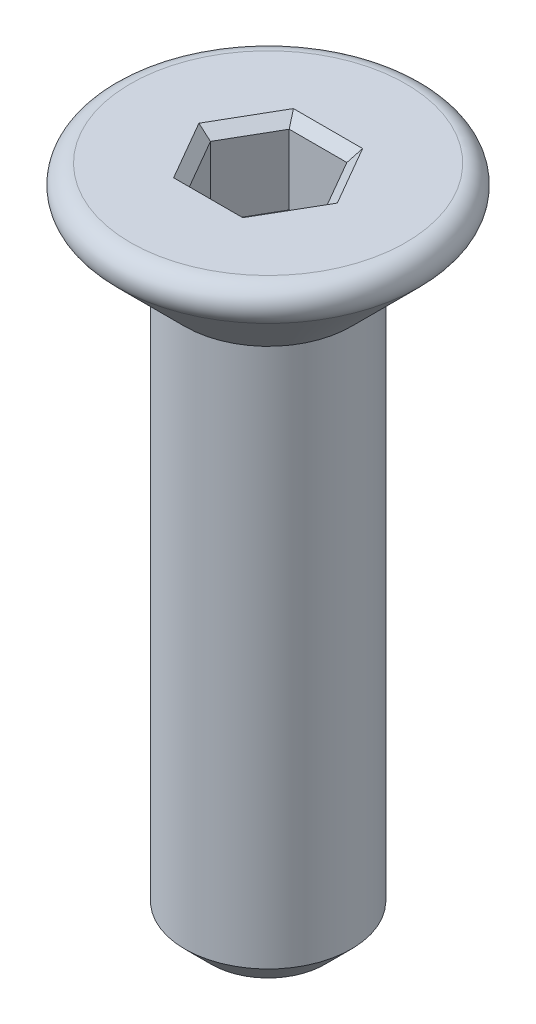
ISO-10303-21;
HEADER;
FILE_DESCRIPTION(('STEP AP214'),'2;1');
FILE_NAME('part.step','',(''),(''),'','','');
FILE_SCHEMA(('AUTOMOTIVE_DESIGN { 1 0 10303 214 1 1 1 1 }'));
ENDSEC;
DATA;
#1=APPLICATION_CONTEXT('core data for automotive mechanical design processes');
#2=APPLICATION_PROTOCOL_DEFINITION('international standard','automotive_design',2000,#1);
#3=PRODUCT_CONTEXT('',#1,'mechanical');
#4=PRODUCT('Part','Part','',(#3));
#5=PRODUCT_RELATED_PRODUCT_CATEGORY('part','',(#4));
#6=PRODUCT_DEFINITION_FORMATION('','',#4);
#7=PRODUCT_DEFINITION_CONTEXT('part definition',#1,'design');
#8=PRODUCT_DEFINITION('design','',#6,#7);
#9=PRODUCT_DEFINITION_SHAPE('','',#8);
#10=(LENGTH_UNIT() NAMED_UNIT(*) SI_UNIT(.MILLI.,.METRE.));
#11=(NAMED_UNIT(*) PLANE_ANGLE_UNIT() SI_UNIT($,.RADIAN.));
#12=(NAMED_UNIT(*) SI_UNIT($,.STERADIAN.) SOLID_ANGLE_UNIT());
#13=UNCERTAINTY_MEASURE_WITH_UNIT(LENGTH_MEASURE(1.E-05),#10,'distance_accuracy_value','');
#14=(GEOMETRIC_REPRESENTATION_CONTEXT(3) GLOBAL_UNCERTAINTY_ASSIGNED_CONTEXT((#13)) GLOBAL_UNIT_ASSIGNED_CONTEXT((#10,
#11,#12)) REPRESENTATION_CONTEXT('',''));
#15=CARTESIAN_POINT('',(0.,0.,0.));
#16=DIRECTION('',(0.,0.,1.));
#17=DIRECTION('',(1.,0.,0.));
#18=AXIS2_PLACEMENT_3D('',#15,#16,#17);
#19=CARTESIAN_POINT('',(0.,0.,0.));
#20=DIRECTION('',(0.,-1.,0.));
#21=DIRECTION('',(0.,0.,-1.));
#22=AXIS2_PLACEMENT_3D('',#19,#20,#21);
#23=PLANE('',#22);
#24=DIRECTION('',(-0.5,0.,-0.866025403784439));
#25=VECTOR('',#24,1.);
#26=CARTESIAN_POINT('',(-0.779422863405994,0.,0.45));
#27=LINE('',#26,#25);
#28=CARTESIAN_POINT('',(-0.519615242270662,0.,0.899999999999999));
#29=VERTEX_POINT('',#28);
#30=CARTESIAN_POINT('',(-1.03923048454132,0.,0.));
#31=VERTEX_POINT('',#30);
#32=EDGE_CURVE('E177',#29,#31,#27,.T.);
#33=ORIENTED_EDGE('',*,*,#32,.T.);
#34=DIRECTION('',(0.5,0.,-0.866025403784439));
#35=VECTOR('',#34,1.);
#36=CARTESIAN_POINT('',(-0.779422863405994,0.,-0.449999999999999));
#37=LINE('',#36,#35);
#38=CARTESIAN_POINT('',(-0.519615242270663,0.,-0.899999999999999));
#39=VERTEX_POINT('',#38);
#40=EDGE_CURVE('E179',#31,#39,#37,.T.);
#41=ORIENTED_EDGE('',*,*,#40,.T.);
#42=DIRECTION('',(1.,0.,0.));
#43=VECTOR('',#42,1.);
#44=CARTESIAN_POINT('',(0.,0.,-0.899999999999999));
#45=LINE('',#44,#43);
#46=CARTESIAN_POINT('',(0.519615242270663,0.,-0.9));
#47=VERTEX_POINT('',#46);
#48=EDGE_CURVE('E169',#39,#47,#45,.T.);
#49=ORIENTED_EDGE('',*,*,#48,.T.);
#50=DIRECTION('',(0.5,0.,0.866025403784439));
#51=VECTOR('',#50,1.);
#52=CARTESIAN_POINT('',(0.779422863405995,0.,-0.45));
#53=LINE('',#52,#51);
#54=CARTESIAN_POINT('',(1.03923048454133,0.,0.));
#55=VERTEX_POINT('',#54);
#56=EDGE_CURVE('E171',#47,#55,#53,.T.);
#57=ORIENTED_EDGE('',*,*,#56,.T.);
#58=DIRECTION('',(-0.5,0.,0.866025403784439));
#59=VECTOR('',#58,1.);
#60=CARTESIAN_POINT('',(0.779422863405994,0.,0.45));
#61=LINE('',#60,#59);
#62=CARTESIAN_POINT('',(0.519615242270663,0.,0.899999999999999));
#63=VERTEX_POINT('',#62);
#64=EDGE_CURVE('E173',#55,#63,#61,.T.);
#65=ORIENTED_EDGE('',*,*,#64,.T.);
#66=DIRECTION('',(-1.,0.,0.));
#67=VECTOR('',#66,1.);
#68=CARTESIAN_POINT('',(0.,0.,0.899999999999999));
#69=LINE('',#68,#67);
#70=EDGE_CURVE('E175',#63,#29,#69,.T.);
#71=ORIENTED_EDGE('',*,*,#70,.T.);
#72=EDGE_LOOP('',(#33,#41,#49,#57,#65,#71));
#73=FACE_BOUND('',#72,.T.);
#74=CARTESIAN_POINT('',(0.,0.,0.));
#75=DIRECTION('',(0.,1.,0.));
#76=DIRECTION('',(0.,0.,1.));
#77=AXIS2_PLACEMENT_3D('',#74,#75,#76);
#78=CIRCLE('',#77,2.06715728752538);
#79=CARTESIAN_POINT('',(0.,0.,2.06715728752538));
#80=VERTEX_POINT('',#79);
#81=EDGE_CURVE('E165',#80,#80,#78,.T.);
#82=ORIENTED_EDGE('',*,*,#81,.T.);
#83=EDGE_LOOP('',(#82));
#84=FACE_BOUND('',#83,.T.);
#85=ADVANCED_FACE('F35',(#73,#84),#23,.F.);
#86=CARTESIAN_POINT('',(0.,-0.282842712474621,0.));
#87=DIRECTION('',(0.,1.,0.));
#88=DIRECTION('',(0.,0.,1.));
#89=AXIS2_PLACEMENT_3D('',#86,#87,#88);
#90=TOROIDAL_SURFACE('',#89,2.06715728752538,0.282842712474621);
#91=ORIENTED_EDGE('',*,*,#81,.F.);
#92=EDGE_LOOP('',(#91));
#93=FACE_BOUND('',#92,.T.);
#94=CARTESIAN_POINT('',(0.,-0.482842712474623,0.));
#95=DIRECTION('',(0.,1.,0.));
#96=DIRECTION('',(0.,0.,1.));
#97=AXIS2_PLACEMENT_3D('',#94,#95,#96);
#98=CIRCLE('',#97,2.26715728752538);
#99=CARTESIAN_POINT('',(0.,-0.482842712474623,2.26715728752538));
#100=VERTEX_POINT('',#99);
#101=EDGE_CURVE('E162',#100,#100,#98,.T.);
#102=ORIENTED_EDGE('',*,*,#101,.T.);
#103=EDGE_LOOP('',(#102));
#104=FACE_BOUND('',#103,.T.);
#105=ADVANCED_FACE('F233',(#93,#104),#90,.T.);
#106=CARTESIAN_POINT('',(0.,-1.5,0.));
#107=DIRECTION('',(0.,1.,0.));
#108=DIRECTION('',(0.,0.,1.));
#109=AXIS2_PLACEMENT_3D('',#106,#107,#108);
#110=CONICAL_SURFACE('',#109,1.25,0.78539816339745);
#111=ORIENTED_EDGE('',*,*,#101,.F.);
#112=EDGE_LOOP('',(#111));
#113=FACE_BOUND('',#112,.T.);
#114=CARTESIAN_POINT('',(0.,-1.5,0.));
#115=DIRECTION('',(0.,1.,0.));
#116=DIRECTION('',(0.,0.,1.));
#117=AXIS2_PLACEMENT_3D('',#114,#115,#116);
#118=CIRCLE('',#117,1.25);
#119=CARTESIAN_POINT('',(0.,-1.5,1.25));
#120=VERTEX_POINT('',#119);
#121=EDGE_CURVE('E159',#120,#120,#118,.T.);
#122=ORIENTED_EDGE('',*,*,#121,.T.);
#123=EDGE_LOOP('',(#122));
#124=FACE_BOUND('',#123,.T.);
#125=ADVANCED_FACE('F239',(#113,#124),#110,.T.);
#126=CARTESIAN_POINT('',(0.,6.97297297297297,0.));
#127=DIRECTION('',(0.,1.,0.));
#128=DIRECTION('',(0.,0.,1.));
#129=AXIS2_PLACEMENT_3D('',#126,#127,#128);
#130=CYLINDRICAL_SURFACE('',#129,1.25);
#131=ORIENTED_EDGE('',*,*,#121,.F.);
#132=EDGE_LOOP('',(#131));
#133=FACE_BOUND('',#132,.T.);
#134=CARTESIAN_POINT('',(0.,-9.6,0.));
#135=DIRECTION('',(0.,1.,0.));
#136=DIRECTION('',(0.,0.,1.));
#137=AXIS2_PLACEMENT_3D('',#134,#135,#136);
#138=CIRCLE('',#137,1.25);
#139=CARTESIAN_POINT('',(0.,-9.6,1.25));
#140=VERTEX_POINT('',#139);
#141=EDGE_CURVE('E156',#140,#140,#138,.T.);
#142=ORIENTED_EDGE('',*,*,#141,.T.);
#143=EDGE_LOOP('',(#142));
#144=FACE_BOUND('',#143,.T.);
#145=ADVANCED_FACE('F360',(#133,#144),#130,.T.);
#146=CARTESIAN_POINT('',(0.,-10.,0.));
#147=DIRECTION('',(0.,1.,0.));
#148=DIRECTION('',(0.,0.,1.));
#149=AXIS2_PLACEMENT_3D('',#146,#147,#148);
#150=CONICAL_SURFACE('',#149,0.850000000000002,0.785398163397451);
#151=ORIENTED_EDGE('',*,*,#141,.F.);
#152=EDGE_LOOP('',(#151));
#153=FACE_BOUND('',#152,.T.);
#154=CARTESIAN_POINT('',(0.,-10.,0.));
#155=DIRECTION('',(0.,1.,0.));
#156=DIRECTION('',(0.,0.,1.));
#157=AXIS2_PLACEMENT_3D('',#154,#155,#156);
#158=CIRCLE('',#157,0.850000000000002);
#159=CARTESIAN_POINT('',(0.,-10.,0.850000000000002));
#160=VERTEX_POINT('',#159);
#161=EDGE_CURVE('E146',#160,#160,#158,.T.);
#162=ORIENTED_EDGE('',*,*,#161,.T.);
#163=EDGE_LOOP('',(#162));
#164=FACE_BOUND('',#163,.T.);
#165=ADVANCED_FACE('F355',(#153,#164),#150,.T.);
#166=CARTESIAN_POINT('',(0.850000000000002,-10.,0.));
#167=DIRECTION('',(0.,1.,0.));
#168=DIRECTION('',(0.,0.,1.));
#169=AXIS2_PLACEMENT_3D('',#166,#167,#168);
#170=PLANE('',#169);
#171=ORIENTED_EDGE('',*,*,#161,.F.);
#172=EDGE_LOOP('',(#171));
#173=FACE_BOUND('',#172,.T.);
#174=ADVANCED_FACE('F330',(#173),#170,.F.);
#175=CARTESIAN_POINT('',(-0.433012701892219,-1.2,-0.75));
#176=DIRECTION('',(-0.866025403784439,0.,-0.5));
#177=DIRECTION('',(-0.5,0.,0.866025403784439));
#178=AXIS2_PLACEMENT_3D('',#175,#176,#177);
#179=PLANE('',#178);
#180=DIRECTION('',(0.,1.,0.));
#181=VECTOR('',#180,1.);
#182=CARTESIAN_POINT('',(-0.433012701892219,-1.2,-0.75));
#183=LINE('',#182,#181);
#184=CARTESIAN_POINT('',(-0.433012701892219,-1.2,-0.75));
#185=VERTEX_POINT('',#184);
#186=CARTESIAN_POINT('',(-0.433012701892219,-0.149999999999999,-0.75));
#187=VERTEX_POINT('',#186);
#188=EDGE_CURVE('E144',#185,#187,#183,.T.);
#189=ORIENTED_EDGE('',*,*,#188,.T.);
#190=DIRECTION('',(-0.5,0.,0.866025403784439));
#191=VECTOR('',#190,1.);
#192=CARTESIAN_POINT('',(-0.433012701892219,-0.149999999999999,-0.75));
#193=LINE('',#192,#191);
#194=CARTESIAN_POINT('',(-0.866025403784438,-0.149999999999999,0.));
#195=VERTEX_POINT('',#194);
#196=EDGE_CURVE('E116',#187,#195,#193,.T.);
#197=ORIENTED_EDGE('',*,*,#196,.T.);
#198=DIRECTION('',(0.,1.,0.));
#199=VECTOR('',#198,1.);
#200=CARTESIAN_POINT('',(-0.866025403784438,-1.2,0.));
#201=LINE('',#200,#199);
#202=CARTESIAN_POINT('',(-0.866025403784438,-1.2,0.));
#203=VERTEX_POINT('',#202);
#204=EDGE_CURVE('E108',#203,#195,#201,.T.);
#205=ORIENTED_EDGE('',*,*,#204,.F.);
#206=DIRECTION('',(-0.5,0.,0.866025403784439));
#207=VECTOR('',#206,1.);
#208=CARTESIAN_POINT('',(-0.433012701892219,-1.2,-0.75));
#209=LINE('',#208,#207);
#210=EDGE_CURVE('E113',#185,#203,#209,.T.);
#211=ORIENTED_EDGE('',*,*,#210,.F.);
#212=EDGE_LOOP('',(#189,#197,#205,#211));
#213=FACE_BOUND('',#212,.T.);
#214=ADVANCED_FACE('F111',(#213),#179,.F.);
#215=CARTESIAN_POINT('',(0.43301270189222,-1.2,-0.750000000000001));
#216=DIRECTION('',(0.,0.,-1.));
#217=DIRECTION('',(-1.,0.,0.));
#218=AXIS2_PLACEMENT_3D('',#215,#216,#217);
#219=PLANE('',#218);
#220=DIRECTION('',(0.,1.,0.));
#221=VECTOR('',#220,1.);
#222=CARTESIAN_POINT('',(0.43301270189222,-1.2,-0.750000000000001));
#223=LINE('',#222,#221);
#224=CARTESIAN_POINT('',(0.43301270189222,-1.2,-0.750000000000001));
#225=VERTEX_POINT('',#224);
#226=CARTESIAN_POINT('',(0.43301270189222,-0.149999999999999,-0.750000000000001));
#227=VERTEX_POINT('',#226);
#228=EDGE_CURVE('E147',#225,#227,#223,.T.);
#229=ORIENTED_EDGE('',*,*,#228,.T.);
#230=DIRECTION('',(-1.,0.,0.));
#231=VECTOR('',#230,1.);
#232=CARTESIAN_POINT('',(0.43301270189222,-0.149999999999999,-0.750000000000001));
#233=LINE('',#232,#231);
#234=EDGE_CURVE('E11',#227,#187,#233,.T.);
#235=ORIENTED_EDGE('',*,*,#234,.T.);
#236=ORIENTED_EDGE('',*,*,#188,.F.);
#237=DIRECTION('',(-1.,0.,0.));
#238=VECTOR('',#237,1.);
#239=CARTESIAN_POINT('',(0.43301270189222,-1.2,-0.750000000000001));
#240=LINE('',#239,#238);
#241=EDGE_CURVE('E119',#225,#185,#240,.T.);
#242=ORIENTED_EDGE('',*,*,#241,.F.);
#243=EDGE_LOOP('',(#229,#235,#236,#242));
#244=FACE_BOUND('',#243,.T.);
#245=ADVANCED_FACE('F217',(#244),#219,.F.);
#246=CARTESIAN_POINT('',(0.866025403784439,-1.2,0.));
#247=DIRECTION('',(0.866025403784439,0.,-0.5));
#248=DIRECTION('',(-0.5,0.,-0.866025403784439));
#249=AXIS2_PLACEMENT_3D('',#246,#247,#248);
#250=PLANE('',#249);
#251=DIRECTION('',(0.,1.,0.));
#252=VECTOR('',#251,1.);
#253=CARTESIAN_POINT('',(0.866025403784439,-1.2,0.));
#254=LINE('',#253,#252);
#255=CARTESIAN_POINT('',(0.866025403784439,-1.2,0.));
#256=VERTEX_POINT('',#255);
#257=CARTESIAN_POINT('',(0.866025403784439,-0.149999999999999,0.));
#258=VERTEX_POINT('',#257);
#259=EDGE_CURVE('E149',#256,#258,#254,.T.);
#260=ORIENTED_EDGE('',*,*,#259,.T.);
#261=DIRECTION('',(-0.5,0.,-0.866025403784439));
#262=VECTOR('',#261,1.);
#263=CARTESIAN_POINT('',(0.866025403784439,-0.149999999999999,0.));
#264=LINE('',#263,#262);
#265=EDGE_CURVE('E44',#258,#227,#264,.T.);
#266=ORIENTED_EDGE('',*,*,#265,.T.);
#267=ORIENTED_EDGE('',*,*,#228,.F.);
#268=DIRECTION('',(-0.5,0.,-0.866025403784439));
#269=VECTOR('',#268,1.);
#270=CARTESIAN_POINT('',(0.866025403784439,-1.2,0.));
#271=LINE('',#270,#269);
#272=EDGE_CURVE('E141',#256,#225,#271,.T.);
#273=ORIENTED_EDGE('',*,*,#272,.F.);
#274=EDGE_LOOP('',(#260,#266,#267,#273));
#275=FACE_BOUND('',#274,.T.);
#276=ADVANCED_FACE('F219',(#275),#250,.F.);
#277=CARTESIAN_POINT('',(0.43301270189222,-1.2,0.75));
#278=DIRECTION('',(0.866025403784439,0.,0.5));
#279=DIRECTION('',(0.5,0.,-0.866025403784439));
#280=AXIS2_PLACEMENT_3D('',#277,#278,#279);
#281=PLANE('',#280);
#282=DIRECTION('',(0.,1.,0.));
#283=VECTOR('',#282,1.);
#284=CARTESIAN_POINT('',(0.43301270189222,-1.2,0.75));
#285=LINE('',#284,#283);
#286=CARTESIAN_POINT('',(0.43301270189222,-1.2,0.75));
#287=VERTEX_POINT('',#286);
#288=CARTESIAN_POINT('',(0.43301270189222,-0.149999999999999,0.75));
#289=VERTEX_POINT('',#288);
#290=EDGE_CURVE('E151',#287,#289,#285,.T.);
#291=ORIENTED_EDGE('',*,*,#290,.T.);
#292=DIRECTION('',(0.5,0.,-0.866025403784439));
#293=VECTOR('',#292,1.);
#294=CARTESIAN_POINT('',(0.43301270189222,-0.149999999999999,0.75));
#295=LINE('',#294,#293);
#296=EDGE_CURVE('E59',#289,#258,#295,.T.);
#297=ORIENTED_EDGE('',*,*,#296,.T.);
#298=ORIENTED_EDGE('',*,*,#259,.F.);
#299=DIRECTION('',(0.5,0.,-0.866025403784439));
#300=VECTOR('',#299,1.);
#301=CARTESIAN_POINT('',(0.43301270189222,-1.2,0.75));
#302=LINE('',#301,#300);
#303=EDGE_CURVE('E138',#287,#256,#302,.T.);
#304=ORIENTED_EDGE('',*,*,#303,.F.);
#305=EDGE_LOOP('',(#291,#297,#298,#304));
#306=FACE_BOUND('',#305,.T.);
#307=ADVANCED_FACE('F221',(#306),#281,.F.);
#308=CARTESIAN_POINT('',(-0.433012701892219,-1.2,0.75));
#309=DIRECTION('',(0.,0.,1.));
#310=DIRECTION('',(1.,0.,0.));
#311=AXIS2_PLACEMENT_3D('',#308,#309,#310);
#312=PLANE('',#311);
#313=DIRECTION('',(0.,1.,0.));
#314=VECTOR('',#313,1.);
#315=CARTESIAN_POINT('',(-0.433012701892219,-1.2,0.75));
#316=LINE('',#315,#314);
#317=CARTESIAN_POINT('',(-0.433012701892219,-1.2,0.75));
#318=VERTEX_POINT('',#317);
#319=CARTESIAN_POINT('',(-0.433012701892219,-0.149999999999999,0.75));
#320=VERTEX_POINT('',#319);
#321=EDGE_CURVE('E118',#318,#320,#316,.T.);
#322=ORIENTED_EDGE('',*,*,#321,.T.);
#323=DIRECTION('',(1.,0.,0.));
#324=VECTOR('',#323,1.);
#325=CARTESIAN_POINT('',(-0.433012701892219,-0.149999999999999,0.75));
#326=LINE('',#325,#324);
#327=EDGE_CURVE('E184',#320,#289,#326,.T.);
#328=ORIENTED_EDGE('',*,*,#327,.T.);
#329=ORIENTED_EDGE('',*,*,#290,.F.);
#330=DIRECTION('',(1.,0.,0.));
#331=VECTOR('',#330,1.);
#332=CARTESIAN_POINT('',(-0.433012701892219,-1.2,0.75));
#333=LINE('',#332,#331);
#334=EDGE_CURVE('E128',#318,#287,#333,.T.);
#335=ORIENTED_EDGE('',*,*,#334,.F.);
#336=EDGE_LOOP('',(#322,#328,#329,#335));
#337=FACE_BOUND('',#336,.T.);
#338=ADVANCED_FACE('F223',(#337),#312,.F.);
#339=CARTESIAN_POINT('',(-0.866025403784438,-1.2,0.));
#340=DIRECTION('',(-0.866025403784439,0.,0.5));
#341=DIRECTION('',(0.5,0.,0.866025403784439));
#342=AXIS2_PLACEMENT_3D('',#339,#340,#341);
#343=PLANE('',#342);
#344=ORIENTED_EDGE('',*,*,#204,.T.);
#345=DIRECTION('',(0.5,0.,0.866025403784439));
#346=VECTOR('',#345,1.);
#347=CARTESIAN_POINT('',(-0.866025403784438,-0.149999999999999,0.));
#348=LINE('',#347,#346);
#349=EDGE_CURVE('E182',#195,#320,#348,.T.);
#350=ORIENTED_EDGE('',*,*,#349,.T.);
#351=ORIENTED_EDGE('',*,*,#321,.F.);
#352=DIRECTION('',(0.5,0.,0.866025403784438));
#353=VECTOR('',#352,1.);
#354=CARTESIAN_POINT('',(-0.866025403784438,-1.2,0.));
#355=LINE('',#354,#353);
#356=EDGE_CURVE('E122',#203,#318,#355,.T.);
#357=ORIENTED_EDGE('',*,*,#356,.F.);
#358=EDGE_LOOP('',(#344,#350,#351,#357));
#359=FACE_BOUND('',#358,.T.);
#360=ADVANCED_FACE('F123',(#359),#343,.F.);
#361=CARTESIAN_POINT('',(0.,-1.2,0.));
#362=DIRECTION('',(0.,1.,0.));
#363=DIRECTION('',(0.,0.,1.));
#364=AXIS2_PLACEMENT_3D('',#361,#362,#363);
#365=PLANE('',#364);
#366=ORIENTED_EDGE('',*,*,#210,.T.);
#367=ORIENTED_EDGE('',*,*,#356,.T.);
#368=ORIENTED_EDGE('',*,*,#334,.T.);
#369=ORIENTED_EDGE('',*,*,#303,.T.);
#370=ORIENTED_EDGE('',*,*,#272,.T.);
#371=ORIENTED_EDGE('',*,*,#241,.T.);
#372=EDGE_LOOP('',(#366,#367,#368,#369,#370,#371));
#373=FACE_BOUND('',#372,.T.);
#374=ADVANCED_FACE('F130',(#373),#365,.T.);
#375=CARTESIAN_POINT('',(0.43301270189222,-0.149999999999999,0.75));
#376=DIRECTION('',(0.612372435695795,-0.707106781186547,0.353553390593274));
#377=DIRECTION('',(0.5,0.,-0.866025403784439));
#378=AXIS2_PLACEMENT_3D('',#375,#376,#377);
#379=PLANE('',#378);
#380=DIRECTION('',(0.377964473009227,0.654653670707977,0.654653670707977));
#381=VECTOR('',#380,1.);
#382=CARTESIAN_POINT('',(0.309294787065871,-0.364285714285713,0.535714285714286));
#383=LINE('',#382,#381);
#384=EDGE_CURVE('E135',#63,#289,#383,.F.);
#385=ORIENTED_EDGE('',*,*,#384,.F.);
#386=ORIENTED_EDGE('',*,*,#64,.F.);
#387=DIRECTION('',(0.755928946018455,0.654653670707977,0.));
#388=VECTOR('',#387,1.);
#389=CARTESIAN_POINT('',(0.618589574131742,-0.364285714285714,0.));
#390=LINE('',#389,#388);
#391=EDGE_CURVE('E39',#258,#55,#390,.T.);
#392=ORIENTED_EDGE('',*,*,#391,.F.);
#393=ORIENTED_EDGE('',*,*,#296,.F.);
#394=EDGE_LOOP('',(#385,#386,#392,#393));
#395=FACE_BOUND('',#394,.T.);
#396=ADVANCED_FACE('F37',(#395),#379,.F.);
#397=CARTESIAN_POINT('',(0.866025403784439,-0.149999999999999,0.));
#398=DIRECTION('',(0.612372435695794,-0.707106781186548,-0.353553390593274));
#399=DIRECTION('',(-0.5,0.,-0.866025403784439));
#400=AXIS2_PLACEMENT_3D('',#397,#398,#399);
#401=PLANE('',#400);
#402=ORIENTED_EDGE('',*,*,#391,.T.);
#403=ORIENTED_EDGE('',*,*,#56,.F.);
#404=DIRECTION('',(0.377964473009228,0.654653670707977,-0.654653670707977));
#405=VECTOR('',#404,1.);
#406=CARTESIAN_POINT('',(0.309294787065871,-0.364285714285713,-0.535714285714287));
#407=LINE('',#406,#405);
#408=EDGE_CURVE('E195',#227,#47,#407,.T.);
#409=ORIENTED_EDGE('',*,*,#408,.F.);
#410=ORIENTED_EDGE('',*,*,#265,.F.);
#411=EDGE_LOOP('',(#402,#403,#409,#410));
#412=FACE_BOUND('',#411,.T.);
#413=ADVANCED_FACE('F210',(#412),#401,.F.);
#414=CARTESIAN_POINT('',(-0.433012701892219,-0.149999999999999,0.75));
#415=DIRECTION('',(0.,-0.707106781186547,0.707106781186548));
#416=DIRECTION('',(1.,0.,0.));
#417=AXIS2_PLACEMENT_3D('',#414,#415,#416);
#418=PLANE('',#417);
#419=ORIENTED_EDGE('',*,*,#384,.T.);
#420=ORIENTED_EDGE('',*,*,#327,.F.);
#421=DIRECTION('',(-0.377964473009228,0.654653670707977,0.654653670707977));
#422=VECTOR('',#421,1.);
#423=CARTESIAN_POINT('',(-0.30929478706587,-0.364285714285713,0.535714285714286));
#424=LINE('',#423,#422);
#425=EDGE_CURVE('E192',#29,#320,#424,.F.);
#426=ORIENTED_EDGE('',*,*,#425,.F.);
#427=ORIENTED_EDGE('',*,*,#70,.F.);
#428=EDGE_LOOP('',(#419,#420,#426,#427));
#429=FACE_BOUND('',#428,.T.);
#430=ADVANCED_FACE('F202',(#429),#418,.F.);
#431=CARTESIAN_POINT('',(0.43301270189222,-0.149999999999999,-0.750000000000001));
#432=DIRECTION('',(0.,-0.707106781186547,-0.707106781186548));
#433=DIRECTION('',(-1.,0.,0.));
#434=AXIS2_PLACEMENT_3D('',#431,#432,#433);
#435=PLANE('',#434);
#436=ORIENTED_EDGE('',*,*,#408,.T.);
#437=ORIENTED_EDGE('',*,*,#48,.F.);
#438=DIRECTION('',(0.377964473009228,-0.654653670707977,0.654653670707977));
#439=VECTOR('',#438,1.);
#440=CARTESIAN_POINT('',(-0.433012701892219,-0.149999999999999,-0.75));
#441=LINE('',#440,#439);
#442=EDGE_CURVE('E190',#187,#39,#441,.F.);
#443=ORIENTED_EDGE('',*,*,#442,.F.);
#444=ORIENTED_EDGE('',*,*,#234,.F.);
#445=EDGE_LOOP('',(#436,#437,#443,#444));
#446=FACE_BOUND('',#445,.T.);
#447=ADVANCED_FACE('F215',(#446),#435,.F.);
#448=CARTESIAN_POINT('',(-0.866025403784438,-0.149999999999999,0.));
#449=DIRECTION('',(-0.612372435695794,-0.707106781186548,0.353553390593274));
#450=DIRECTION('',(0.5,0.,0.866025403784439));
#451=AXIS2_PLACEMENT_3D('',#448,#449,#450);
#452=PLANE('',#451);
#453=ORIENTED_EDGE('',*,*,#425,.T.);
#454=ORIENTED_EDGE('',*,*,#349,.F.);
#455=DIRECTION('',(-0.755928946018455,0.654653670707977,0.));
#456=VECTOR('',#455,1.);
#457=CARTESIAN_POINT('',(-0.618589574131741,-0.364285714285713,0.));
#458=LINE('',#457,#456);
#459=EDGE_CURVE('E188',#31,#195,#458,.F.);
#460=ORIENTED_EDGE('',*,*,#459,.F.);
#461=ORIENTED_EDGE('',*,*,#32,.F.);
#462=EDGE_LOOP('',(#453,#454,#460,#461));
#463=FACE_BOUND('',#462,.T.);
#464=ADVANCED_FACE('F248',(#463),#452,.F.);
#465=CARTESIAN_POINT('',(-0.433012701892219,-0.149999999999999,-0.75));
#466=DIRECTION('',(-0.612372435695794,-0.707106781186548,-0.353553390593274));
#467=DIRECTION('',(-0.5,0.,0.866025403784439));
#468=AXIS2_PLACEMENT_3D('',#465,#466,#467);
#469=PLANE('',#468);
#470=ORIENTED_EDGE('',*,*,#442,.T.);
#471=ORIENTED_EDGE('',*,*,#40,.F.);
#472=ORIENTED_EDGE('',*,*,#459,.T.);
#473=ORIENTED_EDGE('',*,*,#196,.F.);
#474=EDGE_LOOP('',(#470,#471,#472,#473));
#475=FACE_BOUND('',#474,.T.);
#476=ADVANCED_FACE('F245',(#475),#469,.F.);
#477=CLOSED_SHELL('',(#85,#105,#125,#145,#165,#174,#214,#245,#276,#307,#338,#360,#374,#396,#413,
#430,#447,#464,#476));
#478=MANIFOLD_SOLID_BREP('B2',#477);
#479=ADVANCED_BREP_SHAPE_REPRESENTATION('',(#18,#478),#14);
#480=SHAPE_DEFINITION_REPRESENTATION(#9,#479);
ENDSEC;
END-ISO-10303-21;
